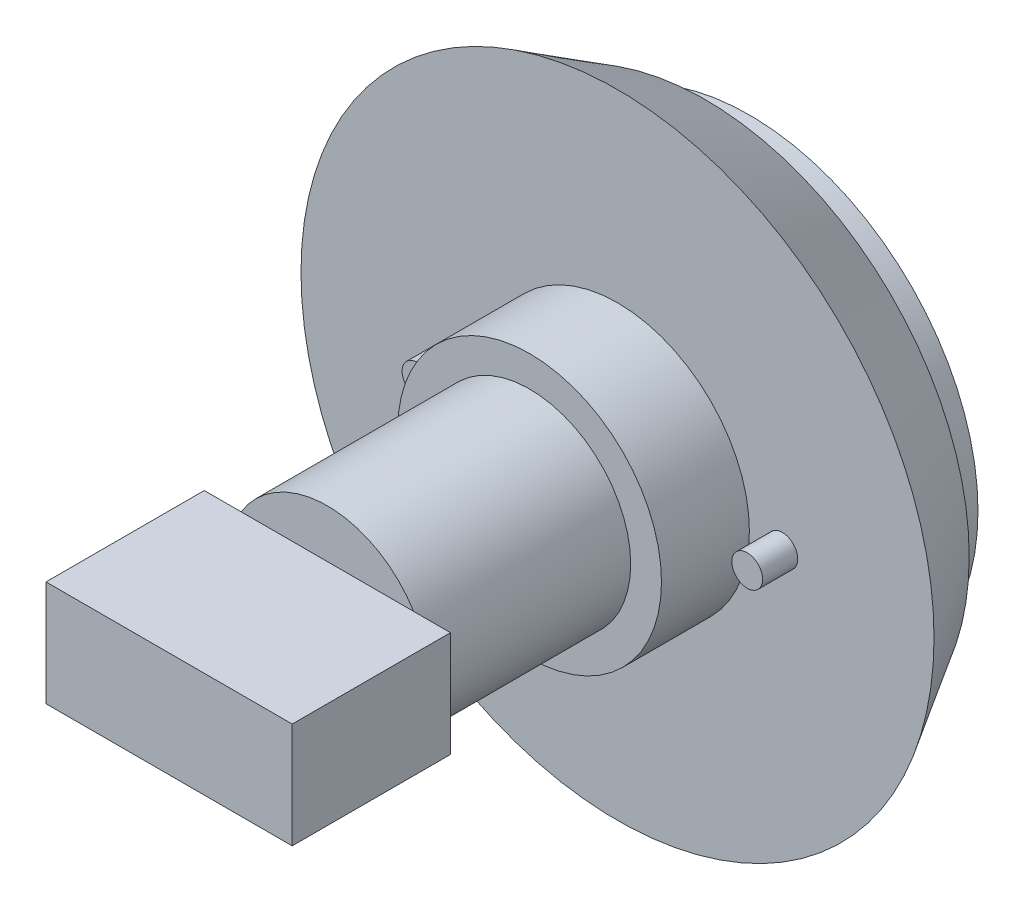
ISO-10303-21;
HEADER;
FILE_DESCRIPTION(('STEP AP214'),'2;1');
FILE_NAME('part.step','',(''),(''),'','','');
FILE_SCHEMA(('AUTOMOTIVE_DESIGN { 1 0 10303 214 1 1 1 1 }'));
ENDSEC;
DATA;
#1=APPLICATION_CONTEXT('core data for automotive mechanical design processes');
#2=APPLICATION_PROTOCOL_DEFINITION('international standard','automotive_design',2000,#1);
#3=PRODUCT_CONTEXT('',#1,'mechanical');
#4=PRODUCT('Part','Part','',(#3));
#5=PRODUCT_RELATED_PRODUCT_CATEGORY('part','',(#4));
#6=PRODUCT_DEFINITION_FORMATION('','',#4);
#7=PRODUCT_DEFINITION_CONTEXT('part definition',#1,'design');
#8=PRODUCT_DEFINITION('design','',#6,#7);
#9=PRODUCT_DEFINITION_SHAPE('','',#8);
#10=(LENGTH_UNIT() NAMED_UNIT(*) SI_UNIT(.MILLI.,.METRE.));
#11=(NAMED_UNIT(*) PLANE_ANGLE_UNIT() SI_UNIT($,.RADIAN.));
#12=(NAMED_UNIT(*) SI_UNIT($,.STERADIAN.) SOLID_ANGLE_UNIT());
#13=UNCERTAINTY_MEASURE_WITH_UNIT(LENGTH_MEASURE(1.E-05),#10,'distance_accuracy_value','');
#14=(GEOMETRIC_REPRESENTATION_CONTEXT(3) GLOBAL_UNCERTAINTY_ASSIGNED_CONTEXT((#13)) GLOBAL_UNIT_ASSIGNED_CONTEXT((#10,
#11,#12)) REPRESENTATION_CONTEXT('',''));
#15=CARTESIAN_POINT('',(0.,0.,0.));
#16=DIRECTION('',(0.,0.,1.));
#17=DIRECTION('',(1.,0.,0.));
#18=AXIS2_PLACEMENT_3D('',#15,#16,#17);
#19=CARTESIAN_POINT('',(0.,0.,48.));
#20=DIRECTION('',(0.,0.,1.));
#21=DIRECTION('',(1.,0.,0.));
#22=AXIS2_PLACEMENT_3D('',#19,#20,#21);
#23=PLANE('',#22);
#24=DIRECTION('',(1.,0.,0.));
#25=VECTOR('',#24,1.);
#26=CARTESIAN_POINT('',(-14.,-6.,48.));
#27=LINE('',#26,#25);
#28=CARTESIAN_POINT('',(-9.81070843517429,-6.,48.));
#29=VERTEX_POINT('',#28);
#30=CARTESIAN_POINT('',(9.81070843517429,-6.,48.));
#31=VERTEX_POINT('',#30);
#32=EDGE_CURVE('E11',#29,#31,#27,.T.);
#33=ORIENTED_EDGE('',*,*,#32,.F.);
#34=CARTESIAN_POINT('',(0.,0.,48.));
#35=DIRECTION('',(0.,0.,1.));
#36=DIRECTION('',(1.,0.,0.));
#37=AXIS2_PLACEMENT_3D('',#34,#35,#36);
#38=CIRCLE('',#37,11.5);
#39=EDGE_CURVE('E225',#29,#31,#38,.T.);
#40=ORIENTED_EDGE('',*,*,#39,.T.);
#41=EDGE_LOOP('',(#33,#40));
#42=FACE_BOUND('',#41,.T.);
#43=ADVANCED_FACE('F33',(#42),#23,.T.);
#44=CARTESIAN_POINT('',(0.,0.,15.));
#45=DIRECTION('',(0.,0.,-1.));
#46=DIRECTION('',(-1.,0.,0.));
#47=AXIS2_PLACEMENT_3D('',#44,#45,#46);
#48=CYLINDRICAL_SURFACE('',#47,26.);
#49=CARTESIAN_POINT('',(0.,0.,5.));
#50=DIRECTION('',(0.,0.,1.));
#51=DIRECTION('',(1.,0.,0.));
#52=AXIS2_PLACEMENT_3D('',#49,#50,#51);
#53=CIRCLE('',#52,26.);
#54=CARTESIAN_POINT('',(26.,0.,5.));
#55=VERTEX_POINT('',#54);
#56=EDGE_CURVE('E129',#55,#55,#53,.T.);
#57=ORIENTED_EDGE('',*,*,#56,.F.);
#58=EDGE_LOOP('',(#57));
#59=FACE_BOUND('',#58,.T.);
#60=CARTESIAN_POINT('',(0.,0.,0.));
#61=DIRECTION('',(0.,0.,1.));
#62=DIRECTION('',(1.,0.,0.));
#63=AXIS2_PLACEMENT_3D('',#60,#61,#62);
#64=CIRCLE('',#63,26.);
#65=CARTESIAN_POINT('',(26.,0.,0.));
#66=VERTEX_POINT('',#65);
#67=EDGE_CURVE('E37',#66,#66,#64,.T.);
#68=ORIENTED_EDGE('',*,*,#67,.T.);
#69=EDGE_LOOP('',(#68));
#70=FACE_BOUND('',#69,.T.);
#71=ADVANCED_FACE('F35',(#59,#70),#48,.T.);
#72=CARTESIAN_POINT('',(0.,0.,0.));
#73=DIRECTION('',(0.,0.,1.));
#74=DIRECTION('',(1.,0.,0.));
#75=AXIS2_PLACEMENT_3D('',#72,#73,#74);
#76=PLANE('',#75);
#77=ORIENTED_EDGE('',*,*,#67,.F.);
#78=EDGE_LOOP('',(#77));
#79=FACE_BOUND('',#78,.T.);
#80=ADVANCED_FACE('F206',(#79),#76,.F.);
#81=CARTESIAN_POINT('',(0.,0.,15.));
#82=DIRECTION('',(0.,0.,1.));
#83=DIRECTION('',(1.,0.,0.));
#84=AXIS2_PLACEMENT_3D('',#81,#82,#83);
#85=CONICAL_SURFACE('',#84,36.,0.540419500270584);
#86=CARTESIAN_POINT('',(0.,0.,5.));
#87=DIRECTION('',(0.,0.,1.));
#88=DIRECTION('',(1.,0.,0.));
#89=AXIS2_PLACEMENT_3D('',#86,#87,#88);
#90=CIRCLE('',#89,30.);
#91=CARTESIAN_POINT('',(30.,0.,5.));
#92=VERTEX_POINT('',#91);
#93=EDGE_CURVE('E134',#92,#92,#90,.T.);
#94=ORIENTED_EDGE('',*,*,#93,.T.);
#95=EDGE_LOOP('',(#94));
#96=FACE_BOUND('',#95,.T.);
#97=CARTESIAN_POINT('',(0.,0.,15.));
#98=DIRECTION('',(0.,0.,1.));
#99=DIRECTION('',(1.,0.,0.));
#100=AXIS2_PLACEMENT_3D('',#97,#98,#99);
#101=CIRCLE('',#100,36.);
#102=CARTESIAN_POINT('',(36.,0.,15.));
#103=VERTEX_POINT('',#102);
#104=EDGE_CURVE('E136',#103,#103,#101,.T.);
#105=ORIENTED_EDGE('',*,*,#104,.F.);
#106=EDGE_LOOP('',(#105));
#107=FACE_BOUND('',#106,.T.);
#108=ADVANCED_FACE('F341',(#96,#107),#85,.T.);
#109=CARTESIAN_POINT('',(30.,0.,5.));
#110=DIRECTION('',(0.,0.,-1.));
#111=DIRECTION('',(-1.,0.,0.));
#112=AXIS2_PLACEMENT_3D('',#109,#110,#111);
#113=PLANE('',#112);
#114=ORIENTED_EDGE('',*,*,#56,.T.);
#115=EDGE_LOOP('',(#114));
#116=FACE_BOUND('',#115,.T.);
#117=ORIENTED_EDGE('',*,*,#93,.F.);
#118=EDGE_LOOP('',(#117));
#119=FACE_BOUND('',#118,.T.);
#120=ADVANCED_FACE('F181',(#116,#119),#113,.T.);
#121=CARTESIAN_POINT('',(0.,0.,15.));
#122=DIRECTION('',(0.,0.,1.));
#123=DIRECTION('',(1.,0.,0.));
#124=AXIS2_PLACEMENT_3D('',#121,#122,#123);
#125=PLANE('',#124);
#126=CARTESIAN_POINT('',(18.75,0.,15.));
#127=DIRECTION('',(0.,0.,1.));
#128=DIRECTION('',(-1.,0.,0.));
#129=AXIS2_PLACEMENT_3D('',#126,#127,#128);
#130=CIRCLE('',#129,1.75);
#131=CARTESIAN_POINT('',(17.,0.,15.));
#132=VERTEX_POINT('',#131);
#133=EDGE_CURVE('E162',#132,#132,#130,.T.);
#134=ORIENTED_EDGE('',*,*,#133,.F.);
#135=EDGE_LOOP('',(#134));
#136=FACE_BOUND('',#135,.T.);
#137=CARTESIAN_POINT('',(-18.75,0.,15.));
#138=DIRECTION('',(0.,0.,1.));
#139=DIRECTION('',(1.,0.,0.));
#140=AXIS2_PLACEMENT_3D('',#137,#138,#139);
#141=CIRCLE('',#140,1.75);
#142=CARTESIAN_POINT('',(-17.,0.,15.));
#143=VERTEX_POINT('',#142);
#144=EDGE_CURVE('E153',#143,#143,#141,.T.);
#145=ORIENTED_EDGE('',*,*,#144,.F.);
#146=EDGE_LOOP('',(#145));
#147=FACE_BOUND('',#146,.T.);
#148=CARTESIAN_POINT('',(0.,0.,15.));
#149=DIRECTION('',(0.,0.,1.));
#150=DIRECTION('',(1.,0.,0.));
#151=AXIS2_PLACEMENT_3D('',#148,#149,#150);
#152=CIRCLE('',#151,15.);
#153=CARTESIAN_POINT('',(15.,0.,15.));
#154=VERTEX_POINT('',#153);
#155=EDGE_CURVE('E123',#154,#154,#152,.T.);
#156=ORIENTED_EDGE('',*,*,#155,.F.);
#157=EDGE_LOOP('',(#156));
#158=FACE_BOUND('',#157,.T.);
#159=ORIENTED_EDGE('',*,*,#104,.T.);
#160=EDGE_LOOP('',(#159));
#161=FACE_BOUND('',#160,.T.);
#162=ADVANCED_FACE('F177',(#136,#147,#158,#161),#125,.T.);
#163=CARTESIAN_POINT('',(0.,0.,25.));
#164=DIRECTION('',(0.,0.,-1.));
#165=DIRECTION('',(-1.,0.,0.));
#166=AXIS2_PLACEMENT_3D('',#163,#164,#165);
#167=CYLINDRICAL_SURFACE('',#166,15.);
#168=CARTESIAN_POINT('',(0.,0.,25.));
#169=DIRECTION('',(0.,0.,1.));
#170=DIRECTION('',(1.,0.,0.));
#171=AXIS2_PLACEMENT_3D('',#168,#169,#170);
#172=CIRCLE('',#171,15.);
#173=CARTESIAN_POINT('',(15.,0.,25.));
#174=VERTEX_POINT('',#173);
#175=EDGE_CURVE('E126',#174,#174,#172,.T.);
#176=ORIENTED_EDGE('',*,*,#175,.F.);
#177=EDGE_LOOP('',(#176));
#178=FACE_BOUND('',#177,.T.);
#179=ORIENTED_EDGE('',*,*,#155,.T.);
#180=EDGE_LOOP('',(#179));
#181=FACE_BOUND('',#180,.T.);
#182=ADVANCED_FACE('F180',(#178,#181),#167,.T.);
#183=CARTESIAN_POINT('',(0.,0.,25.));
#184=DIRECTION('',(0.,0.,1.));
#185=DIRECTION('',(1.,0.,0.));
#186=AXIS2_PLACEMENT_3D('',#183,#184,#185);
#187=PLANE('',#186);
#188=CARTESIAN_POINT('',(0.,0.,25.));
#189=DIRECTION('',(0.,0.,1.));
#190=DIRECTION('',(1.,0.,0.));
#191=AXIS2_PLACEMENT_3D('',#188,#189,#190);
#192=CIRCLE('',#191,11.5);
#193=CARTESIAN_POINT('',(11.5,0.,25.));
#194=VERTEX_POINT('',#193);
#195=EDGE_CURVE('E114',#194,#194,#192,.T.);
#196=ORIENTED_EDGE('',*,*,#195,.F.);
#197=EDGE_LOOP('',(#196));
#198=FACE_BOUND('',#197,.T.);
#199=ORIENTED_EDGE('',*,*,#175,.T.);
#200=EDGE_LOOP('',(#199));
#201=FACE_BOUND('',#200,.T.);
#202=ADVANCED_FACE('F188',(#198,#201),#187,.T.);
#203=CARTESIAN_POINT('',(0.,0.,48.));
#204=DIRECTION('',(0.,0.,-1.));
#205=DIRECTION('',(-1.,0.,0.));
#206=AXIS2_PLACEMENT_3D('',#203,#204,#205);
#207=CYLINDRICAL_SURFACE('',#206,11.5);
#208=CARTESIAN_POINT('',(9.81070843517429,6.,48.));
#209=VERTEX_POINT('',#208);
#210=CARTESIAN_POINT('',(-9.81070843517429,6.,48.));
#211=VERTEX_POINT('',#210);
#212=EDGE_CURVE('E122',#209,#211,#38,.T.);
#213=ORIENTED_EDGE('',*,*,#212,.F.);
#214=EDGE_CURVE('E52',#31,#209,#38,.T.);
#215=ORIENTED_EDGE('',*,*,#214,.F.);
#216=ORIENTED_EDGE('',*,*,#39,.F.);
#217=EDGE_CURVE('E124',#211,#29,#38,.T.);
#218=ORIENTED_EDGE('',*,*,#217,.F.);
#219=EDGE_LOOP('',(#213,#215,#216,#218));
#220=FACE_BOUND('',#219,.T.);
#221=ORIENTED_EDGE('',*,*,#195,.T.);
#222=EDGE_LOOP('',(#221));
#223=FACE_BOUND('',#222,.T.);
#224=ADVANCED_FACE('F195',(#220,#223),#207,.T.);
#225=DIRECTION('',(-1.,0.,0.));
#226=VECTOR('',#225,1.);
#227=CARTESIAN_POINT('',(-14.,6.,48.));
#228=LINE('',#227,#226);
#229=EDGE_CURVE('E42',#209,#211,#228,.T.);
#230=ORIENTED_EDGE('',*,*,#229,.F.);
#231=ORIENTED_EDGE('',*,*,#212,.T.);
#232=EDGE_LOOP('',(#230,#231));
#233=FACE_BOUND('',#232,.T.);
#234=ADVANCED_FACE('F202',(#233),#23,.T.);
#235=CARTESIAN_POINT('',(0.,0.,48.));
#236=DIRECTION('',(0.,0.,1.));
#237=DIRECTION('',(1.,0.,0.));
#238=AXIS2_PLACEMENT_3D('',#235,#236,#237);
#239=PLANE('',#238);
#240=CARTESIAN_POINT('',(-14.,6.,48.));
#241=VERTEX_POINT('',#240);
#242=EDGE_CURVE('E146',#211,#241,#228,.T.);
#243=ORIENTED_EDGE('',*,*,#242,.F.);
#244=ORIENTED_EDGE('',*,*,#217,.T.);
#245=CARTESIAN_POINT('',(-14.,-6.,48.));
#246=VERTEX_POINT('',#245);
#247=EDGE_CURVE('E44',#246,#29,#27,.T.);
#248=ORIENTED_EDGE('',*,*,#247,.F.);
#249=DIRECTION('',(0.,-1.,0.));
#250=VECTOR('',#249,1.);
#251=CARTESIAN_POINT('',(-14.,6.,48.));
#252=LINE('',#251,#250);
#253=EDGE_CURVE('E149',#241,#246,#252,.T.);
#254=ORIENTED_EDGE('',*,*,#253,.F.);
#255=EDGE_LOOP('',(#243,#244,#248,#254));
#256=FACE_BOUND('',#255,.T.);
#257=ADVANCED_FACE('F211',(#256),#239,.F.);
#258=CARTESIAN_POINT('',(14.,-6.,48.));
#259=VERTEX_POINT('',#258);
#260=EDGE_CURVE('E45',#31,#259,#27,.T.);
#261=ORIENTED_EDGE('',*,*,#260,.F.);
#262=ORIENTED_EDGE('',*,*,#214,.T.);
#263=CARTESIAN_POINT('',(14.,6.,48.));
#264=VERTEX_POINT('',#263);
#265=EDGE_CURVE('E145',#264,#209,#228,.T.);
#266=ORIENTED_EDGE('',*,*,#265,.F.);
#267=DIRECTION('',(0.,1.,0.));
#268=VECTOR('',#267,1.);
#269=CARTESIAN_POINT('',(14.,6.,48.));
#270=LINE('',#269,#268);
#271=EDGE_CURVE('E113',#259,#264,#270,.T.);
#272=ORIENTED_EDGE('',*,*,#271,.F.);
#273=EDGE_LOOP('',(#261,#262,#266,#272));
#274=FACE_BOUND('',#273,.T.);
#275=ADVANCED_FACE('F217',(#274),#239,.F.);
#276=CARTESIAN_POINT('',(14.,6.,66.));
#277=DIRECTION('',(-1.,0.,0.));
#278=DIRECTION('',(0.,0.,1.));
#279=AXIS2_PLACEMENT_3D('',#276,#277,#278);
#280=PLANE('',#279);
#281=ORIENTED_EDGE('',*,*,#271,.T.);
#282=DIRECTION('',(0.,0.,-1.));
#283=VECTOR('',#282,1.);
#284=CARTESIAN_POINT('',(14.,6.,66.));
#285=LINE('',#284,#283);
#286=CARTESIAN_POINT('',(14.,6.,66.));
#287=VERTEX_POINT('',#286);
#288=EDGE_CURVE('E94',#287,#264,#285,.T.);
#289=ORIENTED_EDGE('',*,*,#288,.F.);
#290=DIRECTION('',(0.,1.,0.));
#291=VECTOR('',#290,1.);
#292=CARTESIAN_POINT('',(14.,6.,66.));
#293=LINE('',#292,#291);
#294=CARTESIAN_POINT('',(14.,-6.,66.));
#295=VERTEX_POINT('',#294);
#296=EDGE_CURVE('E101',#295,#287,#293,.T.);
#297=ORIENTED_EDGE('',*,*,#296,.F.);
#298=DIRECTION('',(0.,0.,-1.));
#299=VECTOR('',#298,1.);
#300=CARTESIAN_POINT('',(14.,-6.,66.));
#301=LINE('',#300,#299);
#302=EDGE_CURVE('E157',#295,#259,#301,.T.);
#303=ORIENTED_EDGE('',*,*,#302,.T.);
#304=EDGE_LOOP('',(#281,#289,#297,#303));
#305=FACE_BOUND('',#304,.T.);
#306=ADVANCED_FACE('F111',(#305),#280,.F.);
#307=CARTESIAN_POINT('',(-14.,6.,66.));
#308=DIRECTION('',(0.,-1.,0.));
#309=DIRECTION('',(0.,0.,-1.));
#310=AXIS2_PLACEMENT_3D('',#307,#308,#309);
#311=PLANE('',#310);
#312=ORIENTED_EDGE('',*,*,#265,.T.);
#313=ORIENTED_EDGE('',*,*,#229,.T.);
#314=ORIENTED_EDGE('',*,*,#242,.T.);
#315=DIRECTION('',(0.,0.,-1.));
#316=VECTOR('',#315,1.);
#317=CARTESIAN_POINT('',(-14.,6.,66.));
#318=LINE('',#317,#316);
#319=CARTESIAN_POINT('',(-14.,6.,66.));
#320=VERTEX_POINT('',#319);
#321=EDGE_CURVE('E97',#320,#241,#318,.T.);
#322=ORIENTED_EDGE('',*,*,#321,.F.);
#323=DIRECTION('',(-1.,0.,0.));
#324=VECTOR('',#323,1.);
#325=CARTESIAN_POINT('',(-14.,6.,66.));
#326=LINE('',#325,#324);
#327=EDGE_CURVE('E89',#287,#320,#326,.T.);
#328=ORIENTED_EDGE('',*,*,#327,.F.);
#329=ORIENTED_EDGE('',*,*,#288,.T.);
#330=EDGE_LOOP('',(#312,#313,#314,#322,#328,#329));
#331=FACE_BOUND('',#330,.T.);
#332=ADVANCED_FACE('F92',(#331),#311,.F.);
#333=CARTESIAN_POINT('',(-14.,6.,66.));
#334=DIRECTION('',(1.,0.,0.));
#335=DIRECTION('',(0.,1.,0.));
#336=AXIS2_PLACEMENT_3D('',#333,#334,#335);
#337=PLANE('',#336);
#338=ORIENTED_EDGE('',*,*,#253,.T.);
#339=DIRECTION('',(0.,0.,-1.));
#340=VECTOR('',#339,1.);
#341=CARTESIAN_POINT('',(-14.,-6.,66.));
#342=LINE('',#341,#340);
#343=CARTESIAN_POINT('',(-14.,-6.,66.));
#344=VERTEX_POINT('',#343);
#345=EDGE_CURVE('E118',#344,#246,#342,.T.);
#346=ORIENTED_EDGE('',*,*,#345,.F.);
#347=DIRECTION('',(0.,-1.,0.));
#348=VECTOR('',#347,1.);
#349=CARTESIAN_POINT('',(-14.,6.,66.));
#350=LINE('',#349,#348);
#351=EDGE_CURVE('E100',#320,#344,#350,.T.);
#352=ORIENTED_EDGE('',*,*,#351,.F.);
#353=ORIENTED_EDGE('',*,*,#321,.T.);
#354=EDGE_LOOP('',(#338,#346,#352,#353));
#355=FACE_BOUND('',#354,.T.);
#356=ADVANCED_FACE('F235',(#355),#337,.F.);
#357=CARTESIAN_POINT('',(-14.,-6.,66.));
#358=DIRECTION('',(0.,1.,0.));
#359=DIRECTION('',(0.,0.,1.));
#360=AXIS2_PLACEMENT_3D('',#357,#358,#359);
#361=PLANE('',#360);
#362=ORIENTED_EDGE('',*,*,#247,.T.);
#363=ORIENTED_EDGE('',*,*,#32,.T.);
#364=ORIENTED_EDGE('',*,*,#260,.T.);
#365=ORIENTED_EDGE('',*,*,#302,.F.);
#366=DIRECTION('',(1.,0.,0.));
#367=VECTOR('',#366,1.);
#368=CARTESIAN_POINT('',(-14.,-6.,66.));
#369=LINE('',#368,#367);
#370=EDGE_CURVE('E106',#344,#295,#369,.T.);
#371=ORIENTED_EDGE('',*,*,#370,.F.);
#372=ORIENTED_EDGE('',*,*,#345,.T.);
#373=EDGE_LOOP('',(#362,#363,#364,#365,#371,#372));
#374=FACE_BOUND('',#373,.T.);
#375=ADVANCED_FACE('F231',(#374),#361,.F.);
#376=CARTESIAN_POINT('',(0.,0.,66.));
#377=DIRECTION('',(0.,0.,1.));
#378=DIRECTION('',(1.,0.,0.));
#379=AXIS2_PLACEMENT_3D('',#376,#377,#378);
#380=PLANE('',#379);
#381=ORIENTED_EDGE('',*,*,#296,.T.);
#382=ORIENTED_EDGE('',*,*,#327,.T.);
#383=ORIENTED_EDGE('',*,*,#351,.T.);
#384=ORIENTED_EDGE('',*,*,#370,.T.);
#385=EDGE_LOOP('',(#381,#382,#383,#384));
#386=FACE_BOUND('',#385,.T.);
#387=ADVANCED_FACE('F104',(#386),#380,.T.);
#388=CARTESIAN_POINT('',(-18.75,0.,19.));
#389=DIRECTION('',(0.,0.,-1.));
#390=DIRECTION('',(-1.,0.,0.));
#391=AXIS2_PLACEMENT_3D('',#388,#389,#390);
#392=CYLINDRICAL_SURFACE('',#391,1.75);
#393=CARTESIAN_POINT('',(-18.75,0.,19.));
#394=DIRECTION('',(0.,0.,1.));
#395=DIRECTION('',(1.,0.,0.));
#396=AXIS2_PLACEMENT_3D('',#393,#394,#395);
#397=CIRCLE('',#396,1.75);
#398=CARTESIAN_POINT('',(-17.,0.,19.));
#399=VERTEX_POINT('',#398);
#400=EDGE_CURVE('E151',#399,#399,#397,.T.);
#401=ORIENTED_EDGE('',*,*,#400,.F.);
#402=EDGE_LOOP('',(#401));
#403=FACE_BOUND('',#402,.T.);
#404=ORIENTED_EDGE('',*,*,#144,.T.);
#405=EDGE_LOOP('',(#404));
#406=FACE_BOUND('',#405,.T.);
#407=ADVANCED_FACE('F253',(#403,#406),#392,.T.);
#408=CARTESIAN_POINT('',(-18.75,0.,19.));
#409=DIRECTION('',(0.,0.,1.));
#410=DIRECTION('',(1.,0.,0.));
#411=AXIS2_PLACEMENT_3D('',#408,#409,#410);
#412=PLANE('',#411);
#413=ORIENTED_EDGE('',*,*,#400,.T.);
#414=EDGE_LOOP('',(#413));
#415=FACE_BOUND('',#414,.T.);
#416=ADVANCED_FACE('F173',(#415),#412,.T.);
#417=CARTESIAN_POINT('',(18.75,0.,19.));
#418=DIRECTION('',(0.,0.,-1.));
#419=DIRECTION('',(-1.,0.,0.));
#420=AXIS2_PLACEMENT_3D('',#417,#418,#419);
#421=CYLINDRICAL_SURFACE('',#420,1.75);
#422=CARTESIAN_POINT('',(18.75,0.,19.));
#423=DIRECTION('',(0.,0.,1.));
#424=DIRECTION('',(-1.,0.,0.));
#425=AXIS2_PLACEMENT_3D('',#422,#423,#424);
#426=CIRCLE('',#425,1.75);
#427=CARTESIAN_POINT('',(17.,0.,19.));
#428=VERTEX_POINT('',#427);
#429=EDGE_CURVE('E160',#428,#428,#426,.T.);
#430=ORIENTED_EDGE('',*,*,#429,.F.);
#431=EDGE_LOOP('',(#430));
#432=FACE_BOUND('',#431,.T.);
#433=ORIENTED_EDGE('',*,*,#133,.T.);
#434=EDGE_LOOP('',(#433));
#435=FACE_BOUND('',#434,.T.);
#436=ADVANCED_FACE('F170',(#432,#435),#421,.T.);
#437=CARTESIAN_POINT('',(18.75,0.,19.));
#438=DIRECTION('',(0.,0.,-1.));
#439=DIRECTION('',(-1.,0.,0.));
#440=AXIS2_PLACEMENT_3D('',#437,#438,#439);
#441=PLANE('',#440);
#442=ORIENTED_EDGE('',*,*,#429,.T.);
#443=EDGE_LOOP('',(#442));
#444=FACE_BOUND('',#443,.T.);
#445=ADVANCED_FACE('F168',(#444),#441,.F.);
#446=CLOSED_SHELL('',(#43,#71,#80,#108,#120,#162,#182,#202,#224,#234,#257,#275,#306,#332,#356,
#375,#387,#407,#416,#436,#445));
#447=MANIFOLD_SOLID_BREP('B2',#446);
#448=ADVANCED_BREP_SHAPE_REPRESENTATION('',(#18,#447),#14);
#449=SHAPE_DEFINITION_REPRESENTATION(#9,#448);
ENDSEC;
END-ISO-10303-21;
